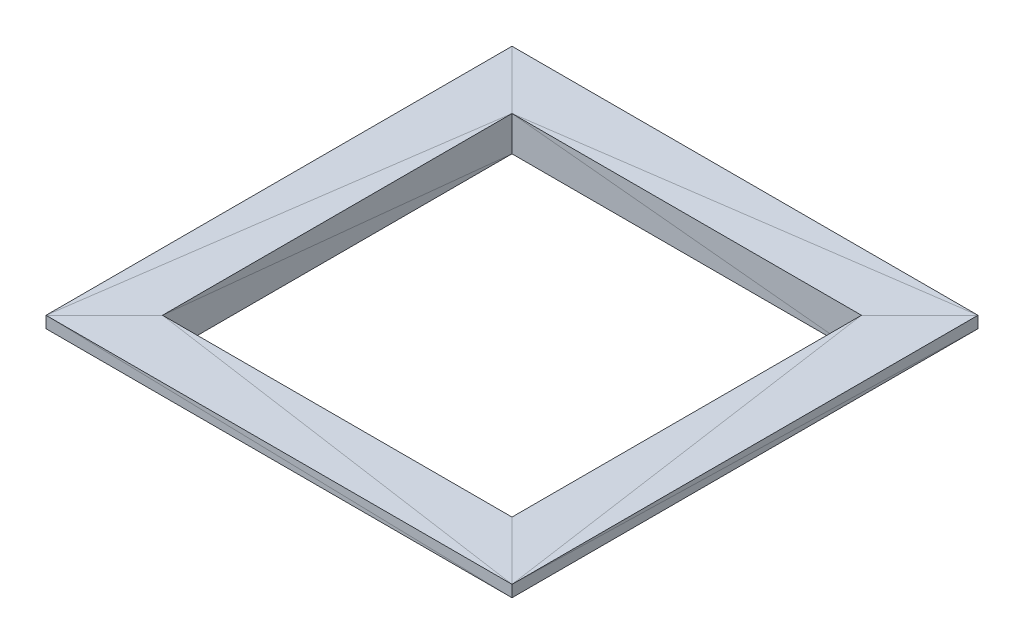
ISO-10303-21;
HEADER;
FILE_DESCRIPTION(('STEP AP214'),'2;1');
FILE_NAME('part.step','',(''),(''),'','','');
FILE_SCHEMA(('AUTOMOTIVE_DESIGN { 1 0 10303 214 1 1 1 1 }'));
ENDSEC;
DATA;
#1=APPLICATION_CONTEXT('core data for automotive mechanical design processes');
#2=APPLICATION_PROTOCOL_DEFINITION('international standard','automotive_design',2000,#1);
#3=PRODUCT_CONTEXT('',#1,'mechanical');
#4=PRODUCT('Part','Part','',(#3));
#5=PRODUCT_RELATED_PRODUCT_CATEGORY('part','',(#4));
#6=PRODUCT_DEFINITION_FORMATION('','',#4);
#7=PRODUCT_DEFINITION_CONTEXT('part definition',#1,'design');
#8=PRODUCT_DEFINITION('design','',#6,#7);
#9=PRODUCT_DEFINITION_SHAPE('','',#8);
#10=(LENGTH_UNIT() NAMED_UNIT(*) SI_UNIT(.MILLI.,.METRE.));
#11=(NAMED_UNIT(*) PLANE_ANGLE_UNIT() SI_UNIT($,.RADIAN.));
#12=(NAMED_UNIT(*) SI_UNIT($,.STERADIAN.) SOLID_ANGLE_UNIT());
#13=UNCERTAINTY_MEASURE_WITH_UNIT(LENGTH_MEASURE(1.E-05),#10,'distance_accuracy_value','');
#14=(GEOMETRIC_REPRESENTATION_CONTEXT(3) GLOBAL_UNCERTAINTY_ASSIGNED_CONTEXT((#13)) GLOBAL_UNIT_ASSIGNED_CONTEXT((#10,
#11,#12)) REPRESENTATION_CONTEXT('',''));
#15=CARTESIAN_POINT('',(0.,0.,0.));
#16=DIRECTION('',(0.,0.,1.));
#17=DIRECTION('',(1.,0.,0.));
#18=AXIS2_PLACEMENT_3D('',#15,#16,#17);
#19=CARTESIAN_POINT('',(0.,41.0000011324882,0.));
#20=DIRECTION('',(0.,-1.,0.));
#21=DIRECTION('',(0.,0.,-1.));
#22=AXIS2_PLACEMENT_3D('',#19,#20,#21);
#23=PLANE('',#22);
#24=DIRECTION('',(0.999480116165667,0.,-0.0322412374059238));
#25=VECTOR('',#24,1.);
#26=CARTESIAN_POINT('',(3.00000002607703,41.0000011324883,35.0000001490116));
#27=LINE('',#26,#25);
#28=CARTESIAN_POINT('',(3.00000002607703,41.0000011324883,35.0000001490116));
#29=VERTEX_POINT('',#28);
#30=CARTESIAN_POINT('',(34.000001847744,41.0000011324883,34.000001847744));
#31=VERTEX_POINT('',#30);
#32=EDGE_CURVE('E301',#29,#31,#27,.T.);
#33=ORIENTED_EDGE('',*,*,#32,.F.);
#34=DIRECTION('',(-0.707107439731254,0.,0.707106122641228));
#35=VECTOR('',#34,1.);
#36=CARTESIAN_POINT('',(4.00000018998981,41.0000011324883,34.000001847744));
#37=LINE('',#36,#35);
#38=CARTESIAN_POINT('',(4.00000018998981,41.0000011324883,34.000001847744));
#39=VERTEX_POINT('',#38);
#40=EDGE_CURVE('E18',#39,#29,#37,.T.);
#41=ORIENTED_EDGE('',*,*,#40,.F.);
#42=DIRECTION('',(-1.,0.,0.));
#43=VECTOR('',#42,1.);
#44=CARTESIAN_POINT('',(34.000001847744,41.0000011324883,34.000001847744));
#45=LINE('',#44,#43);
#46=EDGE_CURVE('E255',#31,#39,#45,.T.);
#47=ORIENTED_EDGE('',*,*,#46,.F.);
#48=EDGE_LOOP('',(#33,#41,#47));
#49=FACE_BOUND('',#48,.T.);
#50=ADVANCED_FACE('F15',(#49),#23,.T.);
#51=CARTESIAN_POINT('',(0.,0.,3.00000002607703));
#52=DIRECTION('',(0.,0.,-1.));
#53=DIRECTION('',(-1.,0.,0.));
#54=AXIS2_PLACEMENT_3D('',#51,#52,#53);
#55=PLANE('',#54);
#56=DIRECTION('',(0.,-1.,0.));
#57=VECTOR('',#56,1.);
#58=CARTESIAN_POINT('',(3.00000002607703,43.0000014603138,3.00000002607703));
#59=LINE('',#58,#57);
#60=CARTESIAN_POINT('',(3.00000002607703,43.0000014603138,3.00000002607703));
#61=VERTEX_POINT('',#60);
#62=CARTESIAN_POINT('',(3.00000002607703,41.0000011324883,3.00000002607703));
#63=VERTEX_POINT('',#62);
#64=EDGE_CURVE('E117',#61,#63,#59,.T.);
#65=ORIENTED_EDGE('',*,*,#64,.F.);
#66=DIRECTION('',(-1.,0.,0.));
#67=VECTOR('',#66,1.);
#68=CARTESIAN_POINT('',(35.0000001490116,43.0000014603138,3.00000002607703));
#69=LINE('',#68,#67);
#70=CARTESIAN_POINT('',(35.0000001490116,43.0000014603138,3.00000002607703));
#71=VERTEX_POINT('',#70);
#72=EDGE_CURVE('E111',#71,#61,#69,.T.);
#73=ORIENTED_EDGE('',*,*,#72,.F.);
#74=DIRECTION('',(0.998052577861257,0.0623782961012874,0.));
#75=VECTOR('',#74,1.);
#76=CARTESIAN_POINT('',(3.00000002607703,41.0000011324883,3.00000002607703));
#77=LINE('',#76,#75);
#78=EDGE_CURVE('E128',#63,#71,#77,.T.);
#79=ORIENTED_EDGE('',*,*,#78,.F.);
#80=EDGE_LOOP('',(#65,#73,#79));
#81=FACE_BOUND('',#80,.T.);
#82=ADVANCED_FACE('F125',(#81),#55,.T.);
#83=CARTESIAN_POINT('',(0.,41.0000011324882,0.));
#84=DIRECTION('',(0.,1.,0.));
#85=DIRECTION('',(0.,0.,1.));
#86=AXIS2_PLACEMENT_3D('',#83,#84,#85);
#87=PLANE('',#86);
#88=DIRECTION('',(0.,0.,1.));
#89=VECTOR('',#88,1.);
#90=CARTESIAN_POINT('',(3.00000002607703,41.0000011324883,3.00000002607703));
#91=LINE('',#90,#89);
#92=EDGE_CURVE('E119',#63,#29,#91,.T.);
#93=ORIENTED_EDGE('',*,*,#92,.F.);
#94=DIRECTION('',(-0.032241297397584,0.,-0.999480114230454));
#95=VECTOR('',#94,1.);
#96=CARTESIAN_POINT('',(4.00000018998981,41.0000011324883,34.000001847744));
#97=LINE('',#96,#95);
#98=EDGE_CURVE('E230',#39,#63,#97,.T.);
#99=ORIENTED_EDGE('',*,*,#98,.F.);
#100=ORIENTED_EDGE('',*,*,#40,.T.);
#101=EDGE_LOOP('',(#93,#99,#100));
#102=FACE_BOUND('',#101,.T.);
#103=ADVANCED_FACE('F767',(#102),#87,.F.);
#104=CARTESIAN_POINT('',(3.00000002607703,0.,0.));
#105=DIRECTION('',(1.,0.,0.));
#106=DIRECTION('',(0.,0.,-1.));
#107=AXIS2_PLACEMENT_3D('',#104,#105,#106);
#108=PLANE('',#107);
#109=ORIENTED_EDGE('',*,*,#92,.T.);
#110=DIRECTION('',(0.,-0.0623782961012874,0.998052577861257));
#111=VECTOR('',#110,1.);
#112=CARTESIAN_POINT('',(3.00000002607703,43.0000014603138,3.00000002607703));
#113=LINE('',#112,#111);
#114=EDGE_CURVE('E103',#61,#29,#113,.T.);
#115=ORIENTED_EDGE('',*,*,#114,.F.);
#116=ORIENTED_EDGE('',*,*,#64,.T.);
#117=EDGE_LOOP('',(#109,#115,#116));
#118=FACE_BOUND('',#117,.T.);
#119=ADVANCED_FACE('F116',(#118),#108,.F.);
#120=CARTESIAN_POINT('',(3.00000002607703,0.,0.));
#121=DIRECTION('',(-1.,0.,0.));
#122=DIRECTION('',(0.,0.,1.));
#123=AXIS2_PLACEMENT_3D('',#120,#121,#122);
#124=PLANE('',#123);
#125=DIRECTION('',(0.,-1.,0.));
#126=VECTOR('',#125,1.);
#127=CARTESIAN_POINT('',(3.00000002607703,43.0000014603138,35.0000001490116));
#128=LINE('',#127,#126);
#129=CARTESIAN_POINT('',(3.00000002607703,43.0000014603138,35.0000001490116));
#130=VERTEX_POINT('',#129);
#131=EDGE_CURVE('E106',#130,#29,#128,.T.);
#132=ORIENTED_EDGE('',*,*,#131,.F.);
#133=DIRECTION('',(0.,0.,1.));
#134=VECTOR('',#133,1.);
#135=CARTESIAN_POINT('',(3.00000002607703,43.0000014603138,3.00000002607703));
#136=LINE('',#135,#134);
#137=EDGE_CURVE('E100',#61,#130,#136,.T.);
#138=ORIENTED_EDGE('',*,*,#137,.F.);
#139=ORIENTED_EDGE('',*,*,#114,.T.);
#140=EDGE_LOOP('',(#132,#138,#139));
#141=FACE_BOUND('',#140,.T.);
#142=ADVANCED_FACE('F102',(#141),#124,.T.);
#143=CARTESIAN_POINT('',(0.,43.9999997615814,0.));
#144=DIRECTION('',(0.,1.,0.));
#145=DIRECTION('',(0.,0.,1.));
#146=AXIS2_PLACEMENT_3D('',#143,#144,#145);
#147=PLANE('',#146);
#148=DIRECTION('',(0.707106649477631,0.,-0.70710691289544));
#149=VECTOR('',#148,1.);
#150=CARTESIAN_POINT('',(34.000001847744,43.9999997615814,4.00000018998981));
#151=LINE('',#150,#149);
#152=CARTESIAN_POINT('',(34.000001847744,43.9999997615814,4.0000001899898));
#153=VERTEX_POINT('',#152);
#154=CARTESIAN_POINT('',(39.0000008046627,43.9999997615814,-1.00000062957406));
#155=VERTEX_POINT('',#154);
#156=EDGE_CURVE('E207',#153,#155,#151,.T.);
#157=ORIENTED_EDGE('',*,*,#156,.F.);
#158=DIRECTION('',(-0.141421324890591,0.,-0.989949498139269));
#159=VECTOR('',#158,1.);
#160=CARTESIAN_POINT('',(39.0000008046627,43.9999997615814,39.0000008046627));
#161=LINE('',#160,#159);
#162=CARTESIAN_POINT('',(39.0000008046627,43.9999997615814,39.0000008046627));
#163=VERTEX_POINT('',#162);
#164=EDGE_CURVE('E209',#163,#153,#161,.T.);
#165=ORIENTED_EDGE('',*,*,#164,.F.);
#166=DIRECTION('',(0.,0.,1.));
#167=VECTOR('',#166,1.);
#168=CARTESIAN_POINT('',(39.0000008046627,43.9999997615814,-1.00000062957406));
#169=LINE('',#168,#167);
#170=EDGE_CURVE('E182',#155,#163,#169,.T.);
#171=ORIENTED_EDGE('',*,*,#170,.F.);
#172=EDGE_LOOP('',(#157,#165,#171));
#173=FACE_BOUND('',#172,.T.);
#174=ADVANCED_FACE('F206',(#173),#147,.T.);
#175=CARTESIAN_POINT('',(39.0000008046627,0.,0.));
#176=DIRECTION('',(1.,0.,0.));
#177=DIRECTION('',(0.,0.,-1.));
#178=AXIS2_PLACEMENT_3D('',#175,#176,#177);
#179=PLANE('',#178);
#180=DIRECTION('',(0.,1.,0.));
#181=VECTOR('',#180,1.);
#182=CARTESIAN_POINT('',(39.0000008046627,43.0000014603138,39.0000008046627));
#183=LINE('',#182,#181);
#184=CARTESIAN_POINT('',(39.0000008046627,43.0000014603138,39.0000008046627));
#185=VERTEX_POINT('',#184);
#186=EDGE_CURVE('E328',#185,#163,#183,.T.);
#187=ORIENTED_EDGE('',*,*,#186,.F.);
#188=DIRECTION('',(0.,0.,1.));
#189=VECTOR('',#188,1.);
#190=CARTESIAN_POINT('',(39.0000008046627,43.0000014603138,-1.00000062957406));
#191=LINE('',#190,#189);
#192=CARTESIAN_POINT('',(39.0000008046627,43.0000014603138,-1.00000062957406));
#193=VERTEX_POINT('',#192);
#194=EDGE_CURVE('E179',#193,#185,#191,.T.);
#195=ORIENTED_EDGE('',*,*,#194,.F.);
#196=DIRECTION('',(0.,-0.0249921478361199,-0.999687647491224));
#197=VECTOR('',#196,1.);
#198=CARTESIAN_POINT('',(39.0000008046627,43.9999997615814,39.0000008046627));
#199=LINE('',#198,#197);
#200=EDGE_CURVE('E121',#163,#193,#199,.T.);
#201=ORIENTED_EDGE('',*,*,#200,.F.);
#202=EDGE_LOOP('',(#187,#195,#201));
#203=FACE_BOUND('',#202,.T.);
#204=ADVANCED_FACE('F737',(#203),#179,.T.);
#205=CARTESIAN_POINT('',(0.,43.0000014603138,0.));
#206=DIRECTION('',(0.,1.,0.));
#207=DIRECTION('',(0.,0.,1.));
#208=AXIS2_PLACEMENT_3D('',#205,#206,#207);
#209=PLANE('',#208);
#210=DIRECTION('',(0.,0.,1.));
#211=VECTOR('',#210,1.);
#212=CARTESIAN_POINT('',(35.0000001490116,43.0000014603138,3.00000002607703));
#213=LINE('',#212,#211);
#214=CARTESIAN_POINT('',(35.0000001490116,43.0000014603138,35.0000001490116));
#215=VERTEX_POINT('',#214);
#216=EDGE_CURVE('E263',#71,#215,#213,.T.);
#217=ORIENTED_EDGE('',*,*,#216,.F.);
#218=DIRECTION('',(-0.11043154159602,0.,-0.993883732949044));
#219=VECTOR('',#218,1.);
#220=CARTESIAN_POINT('',(39.0000008046627,43.0000014603138,39.0000008046627));
#221=LINE('',#220,#219);
#222=EDGE_CURVE('E177',#185,#71,#221,.T.);
#223=ORIENTED_EDGE('',*,*,#222,.F.);
#224=DIRECTION('',(0.707106781186548,0.,0.707106781186548));
#225=VECTOR('',#224,1.);
#226=CARTESIAN_POINT('',(35.0000001490116,43.0000014603138,35.0000001490116));
#227=LINE('',#226,#225);
#228=EDGE_CURVE('E297',#215,#185,#227,.T.);
#229=ORIENTED_EDGE('',*,*,#228,.F.);
#230=EDGE_LOOP('',(#217,#223,#229));
#231=FACE_BOUND('',#230,.T.);
#232=ADVANCED_FACE('F729',(#231),#209,.F.);
#233=CARTESIAN_POINT('',(0.,43.9999997615814,0.));
#234=DIRECTION('',(0.,1.,0.));
#235=DIRECTION('',(0.,0.,1.));
#236=AXIS2_PLACEMENT_3D('',#233,#234,#235);
#237=PLANE('',#236);
#238=DIRECTION('',(-0.707106781186548,0.,-0.707106781186548));
#239=VECTOR('',#238,1.);
#240=CARTESIAN_POINT('',(4.00000018998981,43.9999997615814,4.00000018998981));
#241=LINE('',#240,#239);
#242=CARTESIAN_POINT('',(4.00000018998981,43.9999997615814,4.00000018998981));
#243=VERTEX_POINT('',#242);
#244=CARTESIAN_POINT('',(-1.00000062957406,43.9999997615814,-1.00000062957406));
#245=VERTEX_POINT('',#244);
#246=EDGE_CURVE('E33',#243,#245,#241,.T.);
#247=ORIENTED_EDGE('',*,*,#246,.F.);
#248=DIRECTION('',(-0.989949490763571,0.,0.14142137652048));
#249=VECTOR('',#248,1.);
#250=CARTESIAN_POINT('',(39.0000008046627,43.9999997615814,-1.00000062957406));
#251=LINE('',#250,#249);
#252=EDGE_CURVE('E214',#155,#243,#251,.T.);
#253=ORIENTED_EDGE('',*,*,#252,.F.);
#254=DIRECTION('',(1.,0.,0.));
#255=VECTOR('',#254,1.);
#256=CARTESIAN_POINT('',(-1.00000062957406,43.9999997615814,-1.00000062957406));
#257=LINE('',#256,#255);
#258=EDGE_CURVE('E174',#245,#155,#257,.T.);
#259=ORIENTED_EDGE('',*,*,#258,.F.);
#260=EDGE_LOOP('',(#247,#253,#259));
#261=FACE_BOUND('',#260,.T.);
#262=ADVANCED_FACE('F721',(#261),#237,.T.);
#263=CARTESIAN_POINT('',(39.0000008046627,0.,0.));
#264=DIRECTION('',(-1.,0.,0.));
#265=DIRECTION('',(0.,0.,1.));
#266=AXIS2_PLACEMENT_3D('',#263,#264,#265);
#267=PLANE('',#266);
#268=ORIENTED_EDGE('',*,*,#170,.T.);
#269=ORIENTED_EDGE('',*,*,#200,.T.);
#270=DIRECTION('',(0.,-1.,0.));
#271=VECTOR('',#270,1.);
#272=CARTESIAN_POINT('',(39.0000008046627,43.9999997615814,-1.00000062957406));
#273=LINE('',#272,#271);
#274=EDGE_CURVE('E168',#155,#193,#273,.T.);
#275=ORIENTED_EDGE('',*,*,#274,.F.);
#276=EDGE_LOOP('',(#268,#269,#275));
#277=FACE_BOUND('',#276,.T.);
#278=ADVANCED_FACE('F190',(#277),#267,.F.);
#279=CARTESIAN_POINT('',(0.,43.0000014603138,0.));
#280=DIRECTION('',(0.,-1.,0.));
#281=DIRECTION('',(0.,0.,-1.));
#282=AXIS2_PLACEMENT_3D('',#279,#280,#281);
#283=PLANE('',#282);
#284=ORIENTED_EDGE('',*,*,#222,.T.);
#285=DIRECTION('',(-0.707106781186548,0.,0.707106781186548));
#286=VECTOR('',#285,1.);
#287=CARTESIAN_POINT('',(39.0000008046627,43.0000014603138,-1.00000062957406));
#288=LINE('',#287,#286);
#289=EDGE_CURVE('E137',#193,#71,#288,.T.);
#290=ORIENTED_EDGE('',*,*,#289,.F.);
#291=ORIENTED_EDGE('',*,*,#194,.T.);
#292=EDGE_LOOP('',(#284,#290,#291));
#293=FACE_BOUND('',#292,.T.);
#294=ADVANCED_FACE('F196',(#293),#283,.T.);
#295=CARTESIAN_POINT('',(0.,0.,-1.00000062957406));
#296=DIRECTION('',(0.,0.,1.));
#297=DIRECTION('',(1.,0.,0.));
#298=AXIS2_PLACEMENT_3D('',#295,#296,#297);
#299=PLANE('',#298);
#300=ORIENTED_EDGE('',*,*,#258,.T.);
#301=DIRECTION('',(0.999687647491224,0.0249921478361199,0.));
#302=VECTOR('',#301,1.);
#303=CARTESIAN_POINT('',(-1.00000062957406,43.0000014603138,-1.00000062957406));
#304=LINE('',#303,#302);
#305=CARTESIAN_POINT('',(-1.00000062957406,43.0000014603138,-1.00000062957406));
#306=VERTEX_POINT('',#305);
#307=EDGE_CURVE('E171',#306,#155,#304,.T.);
#308=ORIENTED_EDGE('',*,*,#307,.F.);
#309=DIRECTION('',(0.,-1.,0.));
#310=VECTOR('',#309,1.);
#311=CARTESIAN_POINT('',(-1.00000062957406,43.9999997615814,-1.00000062957406));
#312=LINE('',#311,#310);
#313=EDGE_CURVE('E110',#245,#306,#312,.T.);
#314=ORIENTED_EDGE('',*,*,#313,.F.);
#315=EDGE_LOOP('',(#300,#308,#314));
#316=FACE_BOUND('',#315,.T.);
#317=ADVANCED_FACE('F202',(#316),#299,.F.);
#318=CARTESIAN_POINT('',(0.,0.,-1.00000062957406));
#319=DIRECTION('',(0.,0.,-1.));
#320=DIRECTION('',(-1.,0.,0.));
#321=AXIS2_PLACEMENT_3D('',#318,#319,#320);
#322=PLANE('',#321);
#323=ORIENTED_EDGE('',*,*,#274,.T.);
#324=DIRECTION('',(1.,0.,0.));
#325=VECTOR('',#324,1.);
#326=CARTESIAN_POINT('',(-1.00000062957406,43.0000014603138,-1.00000062957406));
#327=LINE('',#326,#325);
#328=EDGE_CURVE('E155',#306,#193,#327,.T.);
#329=ORIENTED_EDGE('',*,*,#328,.F.);
#330=ORIENTED_EDGE('',*,*,#307,.T.);
#331=EDGE_LOOP('',(#323,#329,#330));
#332=FACE_BOUND('',#331,.T.);
#333=ADVANCED_FACE('F199',(#332),#322,.T.);
#334=CARTESIAN_POINT('',(0.,43.0000014603138,0.));
#335=DIRECTION('',(0.,1.,0.));
#336=DIRECTION('',(0.,0.,1.));
#337=AXIS2_PLACEMENT_3D('',#334,#335,#336);
#338=PLANE('',#337);
#339=ORIENTED_EDGE('',*,*,#72,.T.);
#340=DIRECTION('',(-0.993883732949044,0.,0.11043154159602));
#341=VECTOR('',#340,1.);
#342=CARTESIAN_POINT('',(39.0000008046627,43.0000014603138,-1.00000062957406));
#343=LINE('',#342,#341);
#344=EDGE_CURVE('E134',#193,#61,#343,.T.);
#345=ORIENTED_EDGE('',*,*,#344,.F.);
#346=ORIENTED_EDGE('',*,*,#289,.T.);
#347=EDGE_LOOP('',(#339,#345,#346));
#348=FACE_BOUND('',#347,.T.);
#349=ADVANCED_FACE('F132',(#348),#338,.F.);
#350=CARTESIAN_POINT('',(0.,43.0000014603138,0.));
#351=DIRECTION('',(0.,-1.,0.));
#352=DIRECTION('',(0.,0.,-1.));
#353=AXIS2_PLACEMENT_3D('',#350,#351,#352);
#354=PLANE('',#353);
#355=ORIENTED_EDGE('',*,*,#137,.T.);
#356=DIRECTION('',(0.707106781186548,0.,-0.707106781186548));
#357=VECTOR('',#356,1.);
#358=CARTESIAN_POINT('',(-1.00000062957406,43.0000014603138,39.0000008046627));
#359=LINE('',#358,#357);
#360=CARTESIAN_POINT('',(-1.00000062957406,43.0000014603138,39.0000008046627));
#361=VERTEX_POINT('',#360);
#362=EDGE_CURVE('E143',#361,#130,#359,.T.);
#363=ORIENTED_EDGE('',*,*,#362,.F.);
#364=DIRECTION('',(-0.11043154159602,0.,0.993883732949044));
#365=VECTOR('',#364,1.);
#366=CARTESIAN_POINT('',(3.00000002607703,43.0000014603138,3.00000002607703));
#367=LINE('',#366,#365);
#368=EDGE_CURVE('E141',#61,#361,#367,.T.);
#369=ORIENTED_EDGE('',*,*,#368,.F.);
#370=EDGE_LOOP('',(#355,#363,#369));
#371=FACE_BOUND('',#370,.T.);
#372=ADVANCED_FACE('F142',(#371),#354,.T.);
#373=CARTESIAN_POINT('',(-1.00000062957406,0.,0.));
#374=DIRECTION('',(-1.,0.,0.));
#375=DIRECTION('',(0.,0.,1.));
#376=AXIS2_PLACEMENT_3D('',#373,#374,#375);
#377=PLANE('',#376);
#378=ORIENTED_EDGE('',*,*,#313,.T.);
#379=DIRECTION('',(0.,0.,-1.));
#380=VECTOR('',#379,1.);
#381=CARTESIAN_POINT('',(-1.00000062957406,43.0000014603138,39.0000008046627));
#382=LINE('',#381,#380);
#383=EDGE_CURVE('E148',#361,#306,#382,.T.);
#384=ORIENTED_EDGE('',*,*,#383,.F.);
#385=DIRECTION('',(0.,-0.0249921478361199,0.999687647491224));
#386=VECTOR('',#385,1.);
#387=CARTESIAN_POINT('',(-1.00000062957406,43.9999997615814,-1.00000062957406));
#388=LINE('',#387,#386);
#389=EDGE_CURVE('E322',#245,#361,#388,.T.);
#390=ORIENTED_EDGE('',*,*,#389,.F.);
#391=EDGE_LOOP('',(#378,#384,#390));
#392=FACE_BOUND('',#391,.T.);
#393=ADVANCED_FACE('F670',(#392),#377,.T.);
#394=CARTESIAN_POINT('',(0.,43.0000014603138,0.));
#395=DIRECTION('',(0.,-1.,0.));
#396=DIRECTION('',(0.,0.,-1.));
#397=AXIS2_PLACEMENT_3D('',#394,#395,#396);
#398=PLANE('',#397);
#399=ORIENTED_EDGE('',*,*,#344,.T.);
#400=DIRECTION('',(0.707106781186548,0.,0.707106781186548));
#401=VECTOR('',#400,1.);
#402=CARTESIAN_POINT('',(-1.00000062957406,43.0000014603138,-1.00000062957406));
#403=LINE('',#402,#401);
#404=EDGE_CURVE('E153',#306,#61,#403,.T.);
#405=ORIENTED_EDGE('',*,*,#404,.F.);
#406=ORIENTED_EDGE('',*,*,#328,.T.);
#407=EDGE_LOOP('',(#399,#405,#406));
#408=FACE_BOUND('',#407,.T.);
#409=ADVANCED_FACE('F152',(#408),#398,.T.);
#410=CARTESIAN_POINT('',(0.,43.0000014603138,0.));
#411=DIRECTION('',(0.,1.,0.));
#412=DIRECTION('',(0.,0.,1.));
#413=AXIS2_PLACEMENT_3D('',#410,#411,#412);
#414=PLANE('',#413);
#415=ORIENTED_EDGE('',*,*,#368,.T.);
#416=ORIENTED_EDGE('',*,*,#383,.T.);
#417=ORIENTED_EDGE('',*,*,#404,.T.);
#418=EDGE_LOOP('',(#415,#416,#417));
#419=FACE_BOUND('',#418,.T.);
#420=ADVANCED_FACE('F157',(#419),#414,.F.);
#421=CARTESIAN_POINT('',(0.,43.9999997615814,0.));
#422=DIRECTION('',(0.,1.,0.));
#423=DIRECTION('',(0.,0.,1.));
#424=AXIS2_PLACEMENT_3D('',#421,#422,#423);
#425=PLANE('',#424);
#426=DIRECTION('',(0.14142137652048,0.,-0.989949490763571));
#427=VECTOR('',#426,1.);
#428=CARTESIAN_POINT('',(-1.00000062957406,43.9999997615814,39.0000008046627));
#429=LINE('',#428,#427);
#430=CARTESIAN_POINT('',(-1.00000062957406,43.9999997615814,39.0000008046627));
#431=VERTEX_POINT('',#430);
#432=EDGE_CURVE('E330',#431,#243,#429,.T.);
#433=ORIENTED_EDGE('',*,*,#432,.F.);
#434=DIRECTION('',(-0.70710691289544,0.,0.707106649477631));
#435=VECTOR('',#434,1.);
#436=CARTESIAN_POINT('',(4.00000018998981,43.9999997615814,34.000001847744));
#437=LINE('',#436,#435);
#438=CARTESIAN_POINT('',(4.0000001899898,43.9999997615814,34.000001847744));
#439=VERTEX_POINT('',#438);
#440=EDGE_CURVE('E158',#439,#431,#437,.T.);
#441=ORIENTED_EDGE('',*,*,#440,.F.);
#442=DIRECTION('',(0.,0.,1.));
#443=VECTOR('',#442,1.);
#444=CARTESIAN_POINT('',(4.00000018998981,43.9999997615814,4.00000018998981));
#445=LINE('',#444,#443);
#446=EDGE_CURVE('E222',#243,#439,#445,.T.);
#447=ORIENTED_EDGE('',*,*,#446,.F.);
#448=EDGE_LOOP('',(#433,#441,#447));
#449=FACE_BOUND('',#448,.T.);
#450=ADVANCED_FACE('F352',(#449),#425,.T.);
#451=CARTESIAN_POINT('',(0.,43.9999997615814,0.));
#452=DIRECTION('',(0.,-1.,0.));
#453=DIRECTION('',(0.,0.,-1.));
#454=AXIS2_PLACEMENT_3D('',#451,#452,#453);
#455=PLANE('',#454);
#456=DIRECTION('',(-1.,0.,0.));
#457=VECTOR('',#456,1.);
#458=CARTESIAN_POINT('',(39.0000008046627,43.9999997615814,39.0000008046627));
#459=LINE('',#458,#457);
#460=EDGE_CURVE('E325',#163,#431,#459,.T.);
#461=ORIENTED_EDGE('',*,*,#460,.F.);
#462=DIRECTION('',(0.989949498139269,0.,0.141421324890591));
#463=VECTOR('',#462,1.);
#464=CARTESIAN_POINT('',(4.00000018998981,43.9999997615814,34.000001847744));
#465=LINE('',#464,#463);
#466=EDGE_CURVE('E260',#439,#163,#465,.T.);
#467=ORIENTED_EDGE('',*,*,#466,.F.);
#468=ORIENTED_EDGE('',*,*,#440,.T.);
#469=EDGE_LOOP('',(#461,#467,#468));
#470=FACE_BOUND('',#469,.T.);
#471=ADVANCED_FACE('F348',(#470),#455,.F.);
#472=CARTESIAN_POINT('',(0.,43.9999997615814,0.));
#473=DIRECTION('',(0.,1.,0.));
#474=DIRECTION('',(0.,0.,1.));
#475=AXIS2_PLACEMENT_3D('',#472,#473,#474);
#476=PLANE('',#475);
#477=ORIENTED_EDGE('',*,*,#432,.T.);
#478=ORIENTED_EDGE('',*,*,#246,.T.);
#479=DIRECTION('',(0.,0.,-1.));
#480=VECTOR('',#479,1.);
#481=CARTESIAN_POINT('',(-1.00000062957406,43.9999997615814,39.0000008046627));
#482=LINE('',#481,#480);
#483=EDGE_CURVE('E319',#431,#245,#482,.T.);
#484=ORIENTED_EDGE('',*,*,#483,.F.);
#485=EDGE_LOOP('',(#477,#478,#484));
#486=FACE_BOUND('',#485,.T.);
#487=ADVANCED_FACE('F335',(#486),#476,.T.);
#488=CARTESIAN_POINT('',(0.,0.,39.0000008046627));
#489=DIRECTION('',(0.,0.,-1.));
#490=DIRECTION('',(-1.,0.,0.));
#491=AXIS2_PLACEMENT_3D('',#488,#489,#490);
#492=PLANE('',#491);
#493=ORIENTED_EDGE('',*,*,#460,.T.);
#494=DIRECTION('',(-0.999687647491224,0.0249921478361199,0.));
#495=VECTOR('',#494,1.);
#496=CARTESIAN_POINT('',(39.0000008046627,43.0000014603138,39.0000008046627));
#497=LINE('',#496,#495);
#498=EDGE_CURVE('E316',#185,#431,#497,.T.);
#499=ORIENTED_EDGE('',*,*,#498,.F.);
#500=ORIENTED_EDGE('',*,*,#186,.T.);
#501=EDGE_LOOP('',(#493,#499,#500));
#502=FACE_BOUND('',#501,.T.);
#503=ADVANCED_FACE('F345',(#502),#492,.F.);
#504=CARTESIAN_POINT('',(-1.00000062957406,0.,0.));
#505=DIRECTION('',(1.,0.,0.));
#506=DIRECTION('',(0.,0.,-1.));
#507=AXIS2_PLACEMENT_3D('',#504,#505,#506);
#508=PLANE('',#507);
#509=ORIENTED_EDGE('',*,*,#483,.T.);
#510=ORIENTED_EDGE('',*,*,#389,.T.);
#511=DIRECTION('',(0.,-1.,0.));
#512=VECTOR('',#511,1.);
#513=CARTESIAN_POINT('',(-1.00000062957406,43.9999997615814,39.0000008046627));
#514=LINE('',#513,#512);
#515=EDGE_CURVE('E313',#431,#361,#514,.T.);
#516=ORIENTED_EDGE('',*,*,#515,.F.);
#517=EDGE_LOOP('',(#509,#510,#516));
#518=FACE_BOUND('',#517,.T.);
#519=ADVANCED_FACE('F338',(#518),#508,.F.);
#520=CARTESIAN_POINT('',(0.,0.,39.0000008046627));
#521=DIRECTION('',(0.,0.,1.));
#522=DIRECTION('',(1.,0.,0.));
#523=AXIS2_PLACEMENT_3D('',#520,#521,#522);
#524=PLANE('',#523);
#525=ORIENTED_EDGE('',*,*,#515,.T.);
#526=DIRECTION('',(-1.,0.,0.));
#527=VECTOR('',#526,1.);
#528=CARTESIAN_POINT('',(39.0000008046627,43.0000014603138,39.0000008046627));
#529=LINE('',#528,#527);
#530=EDGE_CURVE('E310',#185,#361,#529,.T.);
#531=ORIENTED_EDGE('',*,*,#530,.F.);
#532=ORIENTED_EDGE('',*,*,#498,.T.);
#533=EDGE_LOOP('',(#525,#531,#532));
#534=FACE_BOUND('',#533,.T.);
#535=ADVANCED_FACE('F342',(#534),#524,.T.);
#536=CARTESIAN_POINT('',(0.,41.0000011324883,0.));
#537=DIRECTION('',(0.,-1.,0.));
#538=DIRECTION('',(0.,0.,-1.));
#539=AXIS2_PLACEMENT_3D('',#536,#537,#538);
#540=PLANE('',#539);
#541=DIRECTION('',(-0.0322412393411354,0.,-0.999480116103241));
#542=VECTOR('',#541,1.);
#543=CARTESIAN_POINT('',(35.0000001490116,41.0000011324883,35.0000001490116));
#544=LINE('',#543,#542);
#545=CARTESIAN_POINT('',(35.0000001490116,41.0000011324883,35.0000001490116));
#546=VERTEX_POINT('',#545);
#547=CARTESIAN_POINT('',(34.000001847744,41.0000011324883,4.00000018998981));
#548=VERTEX_POINT('',#547);
#549=EDGE_CURVE('E281',#546,#548,#544,.T.);
#550=ORIENTED_EDGE('',*,*,#549,.F.);
#551=DIRECTION('',(0.707106781186548,0.,0.707106781186548));
#552=VECTOR('',#551,1.);
#553=CARTESIAN_POINT('',(34.000001847744,41.0000011324883,34.000001847744));
#554=LINE('',#553,#552);
#555=EDGE_CURVE('E304',#31,#546,#554,.T.);
#556=ORIENTED_EDGE('',*,*,#555,.F.);
#557=DIRECTION('',(0.,0.,1.));
#558=VECTOR('',#557,1.);
#559=CARTESIAN_POINT('',(34.000001847744,41.0000011324883,4.00000018998981));
#560=LINE('',#559,#558);
#561=EDGE_CURVE('E224',#548,#31,#560,.T.);
#562=ORIENTED_EDGE('',*,*,#561,.F.);
#563=EDGE_LOOP('',(#550,#556,#562));
#564=FACE_BOUND('',#563,.T.);
#565=ADVANCED_FACE('F604',(#564),#540,.T.);
#566=CARTESIAN_POINT('',(0.,43.0000014603138,0.));
#567=DIRECTION('',(0.,-1.,0.));
#568=DIRECTION('',(0.,0.,-1.));
#569=AXIS2_PLACEMENT_3D('',#566,#567,#568);
#570=PLANE('',#569);
#571=ORIENTED_EDGE('',*,*,#362,.T.);
#572=DIRECTION('',(-0.993883732949044,0.,-0.11043154159602));
#573=VECTOR('',#572,1.);
#574=CARTESIAN_POINT('',(39.0000008046627,43.0000014603138,39.0000008046627));
#575=LINE('',#574,#573);
#576=EDGE_CURVE('E298',#185,#130,#575,.T.);
#577=ORIENTED_EDGE('',*,*,#576,.F.);
#578=ORIENTED_EDGE('',*,*,#530,.T.);
#579=EDGE_LOOP('',(#571,#577,#578));
#580=FACE_BOUND('',#579,.T.);
#581=ADVANCED_FACE('F595',(#580),#570,.T.);
#582=CARTESIAN_POINT('',(0.,41.0000011324883,0.));
#583=DIRECTION('',(0.,1.,0.));
#584=DIRECTION('',(0.,0.,1.));
#585=AXIS2_PLACEMENT_3D('',#582,#583,#584);
#586=PLANE('',#585);
#587=DIRECTION('',(1.,0.,0.));
#588=VECTOR('',#587,1.);
#589=CARTESIAN_POINT('',(3.00000002607703,41.0000011324883,35.0000001490116));
#590=LINE('',#589,#588);
#591=EDGE_CURVE('E291',#29,#546,#590,.T.);
#592=ORIENTED_EDGE('',*,*,#591,.F.);
#593=ORIENTED_EDGE('',*,*,#32,.T.);
#594=ORIENTED_EDGE('',*,*,#555,.T.);
#595=EDGE_LOOP('',(#592,#593,#594));
#596=FACE_BOUND('',#595,.T.);
#597=ADVANCED_FACE('F586',(#596),#586,.F.);
#598=CARTESIAN_POINT('',(0.,43.0000014603138,0.));
#599=DIRECTION('',(0.,-1.,0.));
#600=DIRECTION('',(0.,0.,-1.));
#601=AXIS2_PLACEMENT_3D('',#598,#599,#600);
#602=PLANE('',#601);
#603=DIRECTION('',(-1.,0.,0.));
#604=VECTOR('',#603,1.);
#605=CARTESIAN_POINT('',(35.0000001490116,43.0000014603138,35.0000001490116));
#606=LINE('',#605,#604);
#607=EDGE_CURVE('E288',#215,#130,#606,.T.);
#608=ORIENTED_EDGE('',*,*,#607,.F.);
#609=ORIENTED_EDGE('',*,*,#228,.T.);
#610=ORIENTED_EDGE('',*,*,#576,.T.);
#611=EDGE_LOOP('',(#608,#609,#610));
#612=FACE_BOUND('',#611,.T.);
#613=ADVANCED_FACE('F577',(#612),#602,.T.);
#614=CARTESIAN_POINT('',(0.,0.,35.0000001490116));
#615=DIRECTION('',(0.,0.,-1.));
#616=DIRECTION('',(-1.,0.,0.));
#617=AXIS2_PLACEMENT_3D('',#614,#615,#616);
#618=PLANE('',#617);
#619=ORIENTED_EDGE('',*,*,#591,.T.);
#620=DIRECTION('',(0.998052577861257,-0.0623782961012874,0.));
#621=VECTOR('',#620,1.);
#622=CARTESIAN_POINT('',(3.00000002607703,43.0000014603138,35.0000001490116));
#623=LINE('',#622,#621);
#624=EDGE_CURVE('E285',#130,#546,#623,.T.);
#625=ORIENTED_EDGE('',*,*,#624,.F.);
#626=ORIENTED_EDGE('',*,*,#131,.T.);
#627=EDGE_LOOP('',(#619,#625,#626));
#628=FACE_BOUND('',#627,.T.);
#629=ADVANCED_FACE('F568',(#628),#618,.F.);
#630=CARTESIAN_POINT('',(0.,0.,35.0000001490116));
#631=DIRECTION('',(0.,0.,1.));
#632=DIRECTION('',(1.,0.,0.));
#633=AXIS2_PLACEMENT_3D('',#630,#631,#632);
#634=PLANE('',#633);
#635=DIRECTION('',(0.,-1.,0.));
#636=VECTOR('',#635,1.);
#637=CARTESIAN_POINT('',(35.0000001490116,43.0000014603138,35.0000001490116));
#638=LINE('',#637,#636);
#639=EDGE_CURVE('E274',#215,#546,#638,.T.);
#640=ORIENTED_EDGE('',*,*,#639,.F.);
#641=ORIENTED_EDGE('',*,*,#607,.T.);
#642=ORIENTED_EDGE('',*,*,#624,.T.);
#643=EDGE_LOOP('',(#640,#641,#642));
#644=FACE_BOUND('',#643,.T.);
#645=ADVANCED_FACE('F560',(#644),#634,.T.);
#646=CARTESIAN_POINT('',(0.,41.0000011324882,0.));
#647=DIRECTION('',(0.,-1.,0.));
#648=DIRECTION('',(0.,0.,-1.));
#649=AXIS2_PLACEMENT_3D('',#646,#647,#648);
#650=PLANE('',#649);
#651=DIRECTION('',(-1.,0.,0.));
#652=VECTOR('',#651,1.);
#653=CARTESIAN_POINT('',(35.0000001490116,41.0000011324883,3.00000002607703));
#654=LINE('',#653,#652);
#655=CARTESIAN_POINT('',(35.0000001490116,41.0000011324883,3.00000002607703));
#656=VERTEX_POINT('',#655);
#657=EDGE_CURVE('E277',#656,#63,#654,.T.);
#658=ORIENTED_EDGE('',*,*,#657,.F.);
#659=DIRECTION('',(0.707106122641228,0.,-0.707107439731254));
#660=VECTOR('',#659,1.);
#661=CARTESIAN_POINT('',(34.000001847744,41.0000011324883,4.00000018998981));
#662=LINE('',#661,#660);
#663=EDGE_CURVE('E282',#548,#656,#662,.T.);
#664=ORIENTED_EDGE('',*,*,#663,.F.);
#665=DIRECTION('',(0.999480114230454,0.,0.032241297397584));
#666=VECTOR('',#665,1.);
#667=CARTESIAN_POINT('',(3.00000002607703,41.0000011324883,3.00000002607703));
#668=LINE('',#667,#666);
#669=EDGE_CURVE('E373',#63,#548,#668,.T.);
#670=ORIENTED_EDGE('',*,*,#669,.F.);
#671=EDGE_LOOP('',(#658,#664,#670));
#672=FACE_BOUND('',#671,.T.);
#673=ADVANCED_FACE('F551',(#672),#650,.T.);
#674=CARTESIAN_POINT('',(0.,41.0000011324882,0.));
#675=DIRECTION('',(0.,1.,0.));
#676=DIRECTION('',(0.,0.,1.));
#677=AXIS2_PLACEMENT_3D('',#674,#675,#676);
#678=PLANE('',#677);
#679=DIRECTION('',(0.,0.,-1.));
#680=VECTOR('',#679,1.);
#681=CARTESIAN_POINT('',(35.0000001490116,41.0000011324883,35.0000001490116));
#682=LINE('',#681,#680);
#683=EDGE_CURVE('E271',#546,#656,#682,.T.);
#684=ORIENTED_EDGE('',*,*,#683,.F.);
#685=ORIENTED_EDGE('',*,*,#549,.T.);
#686=ORIENTED_EDGE('',*,*,#663,.T.);
#687=EDGE_LOOP('',(#684,#685,#686));
#688=FACE_BOUND('',#687,.T.);
#689=ADVANCED_FACE('F542',(#688),#678,.F.);
#690=CARTESIAN_POINT('',(0.,0.,3.00000002607703));
#691=DIRECTION('',(0.,0.,1.));
#692=DIRECTION('',(1.,0.,0.));
#693=AXIS2_PLACEMENT_3D('',#690,#691,#692);
#694=PLANE('',#693);
#695=ORIENTED_EDGE('',*,*,#657,.T.);
#696=ORIENTED_EDGE('',*,*,#78,.T.);
#697=DIRECTION('',(0.,1.,0.));
#698=VECTOR('',#697,1.);
#699=CARTESIAN_POINT('',(35.0000001490116,41.0000011324883,3.00000002607703));
#700=LINE('',#699,#698);
#701=EDGE_CURVE('E266',#656,#71,#700,.T.);
#702=ORIENTED_EDGE('',*,*,#701,.F.);
#703=EDGE_LOOP('',(#695,#696,#702));
#704=FACE_BOUND('',#703,.T.);
#705=ADVANCED_FACE('F533',(#704),#694,.F.);
#706=CARTESIAN_POINT('',(35.0000001490116,0.,0.));
#707=DIRECTION('',(-1.,0.,0.));
#708=DIRECTION('',(0.,0.,1.));
#709=AXIS2_PLACEMENT_3D('',#706,#707,#708);
#710=PLANE('',#709);
#711=ORIENTED_EDGE('',*,*,#683,.T.);
#712=DIRECTION('',(0.,-0.0623782961012874,-0.998052577861257));
#713=VECTOR('',#712,1.);
#714=CARTESIAN_POINT('',(35.0000001490116,43.0000014603138,35.0000001490116));
#715=LINE('',#714,#713);
#716=EDGE_CURVE('E262',#215,#656,#715,.T.);
#717=ORIENTED_EDGE('',*,*,#716,.F.);
#718=ORIENTED_EDGE('',*,*,#639,.T.);
#719=EDGE_LOOP('',(#711,#717,#718));
#720=FACE_BOUND('',#719,.T.);
#721=ADVANCED_FACE('F524',(#720),#710,.F.);
#722=CARTESIAN_POINT('',(35.0000001490116,0.,0.));
#723=DIRECTION('',(1.,0.,0.));
#724=DIRECTION('',(0.,0.,-1.));
#725=AXIS2_PLACEMENT_3D('',#722,#723,#724);
#726=PLANE('',#725);
#727=ORIENTED_EDGE('',*,*,#701,.T.);
#728=ORIENTED_EDGE('',*,*,#216,.T.);
#729=ORIENTED_EDGE('',*,*,#716,.T.);
#730=EDGE_LOOP('',(#727,#728,#729));
#731=FACE_BOUND('',#730,.T.);
#732=ADVANCED_FACE('F516',(#731),#726,.T.);
#733=CARTESIAN_POINT('',(0.,43.9999997615814,0.));
#734=DIRECTION('',(0.,1.,0.));
#735=DIRECTION('',(0.,0.,1.));
#736=AXIS2_PLACEMENT_3D('',#733,#734,#735);
#737=PLANE('',#736);
#738=DIRECTION('',(0.707106781186548,0.,0.707106781186548));
#739=VECTOR('',#738,1.);
#740=CARTESIAN_POINT('',(34.000001847744,43.9999997615814,34.000001847744));
#741=LINE('',#740,#739);
#742=CARTESIAN_POINT('',(34.000001847744,43.9999997615814,34.000001847744));
#743=VERTEX_POINT('',#742);
#744=EDGE_CURVE('E253',#743,#163,#741,.T.);
#745=ORIENTED_EDGE('',*,*,#744,.F.);
#746=DIRECTION('',(1.,0.,0.));
#747=VECTOR('',#746,1.);
#748=CARTESIAN_POINT('',(4.00000018998981,43.9999997615814,34.000001847744));
#749=LINE('',#748,#747);
#750=EDGE_CURVE('E247',#439,#743,#749,.T.);
#751=ORIENTED_EDGE('',*,*,#750,.F.);
#752=ORIENTED_EDGE('',*,*,#466,.T.);
#753=EDGE_LOOP('',(#745,#751,#752));
#754=FACE_BOUND('',#753,.T.);
#755=ADVANCED_FACE('F356',(#754),#737,.T.);
#756=CARTESIAN_POINT('',(0.,0.,34.000001847744));
#757=DIRECTION('',(0.,0.,-1.));
#758=DIRECTION('',(-1.,0.,0.));
#759=AXIS2_PLACEMENT_3D('',#756,#757,#758);
#760=PLANE('',#759);
#761=DIRECTION('',(0.,1.,0.));
#762=VECTOR('',#761,1.);
#763=CARTESIAN_POINT('',(34.000001847744,41.0000011324883,34.000001847744));
#764=LINE('',#763,#762);
#765=EDGE_CURVE('E244',#31,#743,#764,.T.);
#766=ORIENTED_EDGE('',*,*,#765,.F.);
#767=ORIENTED_EDGE('',*,*,#46,.T.);
#768=DIRECTION('',(-0.995037195256377,-0.0995036685571074,0.));
#769=VECTOR('',#768,1.);
#770=CARTESIAN_POINT('',(34.000001847744,43.9999997615814,34.000001847744));
#771=LINE('',#770,#769);
#772=EDGE_CURVE('E250',#743,#39,#771,.T.);
#773=ORIENTED_EDGE('',*,*,#772,.F.);
#774=EDGE_LOOP('',(#766,#767,#773));
#775=FACE_BOUND('',#774,.T.);
#776=ADVANCED_FACE('F404',(#775),#760,.T.);
#777=CARTESIAN_POINT('',(0.,43.9999997615814,0.));
#778=DIRECTION('',(0.,1.,0.));
#779=DIRECTION('',(0.,0.,1.));
#780=AXIS2_PLACEMENT_3D('',#777,#778,#779);
#781=PLANE('',#780);
#782=DIRECTION('',(0.,0.,-1.));
#783=VECTOR('',#782,1.);
#784=CARTESIAN_POINT('',(34.000001847744,43.9999997615814,34.000001847744));
#785=LINE('',#784,#783);
#786=EDGE_CURVE('E241',#743,#153,#785,.T.);
#787=ORIENTED_EDGE('',*,*,#786,.F.);
#788=ORIENTED_EDGE('',*,*,#744,.T.);
#789=ORIENTED_EDGE('',*,*,#164,.T.);
#790=EDGE_LOOP('',(#787,#788,#789));
#791=FACE_BOUND('',#790,.T.);
#792=ADVANCED_FACE('F402',(#791),#781,.T.);
#793=CARTESIAN_POINT('',(0.,0.,34.000001847744));
#794=DIRECTION('',(0.,0.,1.));
#795=DIRECTION('',(1.,0.,0.));
#796=AXIS2_PLACEMENT_3D('',#793,#794,#795);
#797=PLANE('',#796);
#798=ORIENTED_EDGE('',*,*,#750,.T.);
#799=ORIENTED_EDGE('',*,*,#772,.T.);
#800=DIRECTION('',(0.,-1.,0.));
#801=VECTOR('',#800,1.);
#802=CARTESIAN_POINT('',(4.00000018998981,43.9999997615814,34.000001847744));
#803=LINE('',#802,#801);
#804=EDGE_CURVE('E238',#439,#39,#803,.T.);
#805=ORIENTED_EDGE('',*,*,#804,.F.);
#806=EDGE_LOOP('',(#798,#799,#805));
#807=FACE_BOUND('',#806,.T.);
#808=ADVANCED_FACE('F360',(#807),#797,.F.);
#809=CARTESIAN_POINT('',(34.000001847744,0.,0.));
#810=DIRECTION('',(1.,0.,0.));
#811=DIRECTION('',(0.,0.,-1.));
#812=AXIS2_PLACEMENT_3D('',#809,#810,#811);
#813=PLANE('',#812);
#814=ORIENTED_EDGE('',*,*,#786,.T.);
#815=DIRECTION('',(0.,0.0995036685571074,-0.995037195256377));
#816=VECTOR('',#815,1.);
#817=CARTESIAN_POINT('',(34.000001847744,41.0000011324883,34.000001847744));
#818=LINE('',#817,#816);
#819=EDGE_CURVE('E227',#31,#153,#818,.T.);
#820=ORIENTED_EDGE('',*,*,#819,.F.);
#821=ORIENTED_EDGE('',*,*,#765,.T.);
#822=EDGE_LOOP('',(#814,#820,#821));
#823=FACE_BOUND('',#822,.T.);
#824=ADVANCED_FACE('F398',(#823),#813,.F.);
#825=CARTESIAN_POINT('',(4.00000018998981,0.,0.));
#826=DIRECTION('',(1.,0.,0.));
#827=DIRECTION('',(0.,0.,-1.));
#828=AXIS2_PLACEMENT_3D('',#825,#826,#827);
#829=PLANE('',#828);
#830=ORIENTED_EDGE('',*,*,#804,.T.);
#831=DIRECTION('',(0.,0.,1.));
#832=VECTOR('',#831,1.);
#833=CARTESIAN_POINT('',(4.00000018998981,41.0000011324883,4.00000018998981));
#834=LINE('',#833,#832);
#835=CARTESIAN_POINT('',(4.00000018998981,41.0000011324883,4.00000018998981));
#836=VERTEX_POINT('',#835);
#837=EDGE_CURVE('E235',#836,#39,#834,.T.);
#838=ORIENTED_EDGE('',*,*,#837,.F.);
#839=DIRECTION('',(0.,-0.0995036685571074,-0.995037195256377));
#840=VECTOR('',#839,1.);
#841=CARTESIAN_POINT('',(4.00000018998981,43.9999997615814,34.000001847744));
#842=LINE('',#841,#840);
#843=EDGE_CURVE('E219',#439,#836,#842,.T.);
#844=ORIENTED_EDGE('',*,*,#843,.F.);
#845=EDGE_LOOP('',(#830,#838,#844));
#846=FACE_BOUND('',#845,.T.);
#847=ADVANCED_FACE('F363',(#846),#829,.T.);
#848=CARTESIAN_POINT('',(0.,41.0000011324883,0.));
#849=DIRECTION('',(0.,-1.,0.));
#850=DIRECTION('',(0.,0.,-1.));
#851=AXIS2_PLACEMENT_3D('',#848,#849,#850);
#852=PLANE('',#851);
#853=ORIENTED_EDGE('',*,*,#98,.T.);
#854=DIRECTION('',(-0.707106781186548,0.,-0.707106781186548));
#855=VECTOR('',#854,1.);
#856=CARTESIAN_POINT('',(4.00000018998981,41.0000011324883,4.00000018998981));
#857=LINE('',#856,#855);
#858=EDGE_CURVE('E370',#836,#63,#857,.T.);
#859=ORIENTED_EDGE('',*,*,#858,.F.);
#860=ORIENTED_EDGE('',*,*,#837,.T.);
#861=EDGE_LOOP('',(#853,#859,#860));
#862=FACE_BOUND('',#861,.T.);
#863=ADVANCED_FACE('F429',(#862),#852,.T.);
#864=CARTESIAN_POINT('',(34.000001847744,0.,0.));
#865=DIRECTION('',(-1.,0.,0.));
#866=DIRECTION('',(0.,0.,1.));
#867=AXIS2_PLACEMENT_3D('',#864,#865,#866);
#868=PLANE('',#867);
#869=DIRECTION('',(0.,1.,0.));
#870=VECTOR('',#869,1.);
#871=CARTESIAN_POINT('',(34.000001847744,41.0000011324883,4.00000018998981));
#872=LINE('',#871,#870);
#873=EDGE_CURVE('E378',#548,#153,#872,.T.);
#874=ORIENTED_EDGE('',*,*,#873,.F.);
#875=ORIENTED_EDGE('',*,*,#561,.T.);
#876=ORIENTED_EDGE('',*,*,#819,.T.);
#877=EDGE_LOOP('',(#874,#875,#876));
#878=FACE_BOUND('',#877,.T.);
#879=ADVANCED_FACE('F395',(#878),#868,.T.);
#880=CARTESIAN_POINT('',(0.,43.9999997615814,0.));
#881=DIRECTION('',(0.,1.,0.));
#882=DIRECTION('',(0.,0.,1.));
#883=AXIS2_PLACEMENT_3D('',#880,#881,#882);
#884=PLANE('',#883);
#885=DIRECTION('',(-1.,0.,0.));
#886=VECTOR('',#885,1.);
#887=CARTESIAN_POINT('',(34.000001847744,43.9999997615814,4.00000018998981));
#888=LINE('',#887,#886);
#889=EDGE_CURVE('E217',#153,#243,#888,.T.);
#890=ORIENTED_EDGE('',*,*,#889,.F.);
#891=ORIENTED_EDGE('',*,*,#156,.T.);
#892=ORIENTED_EDGE('',*,*,#252,.T.);
#893=EDGE_LOOP('',(#890,#891,#892));
#894=FACE_BOUND('',#893,.T.);
#895=ADVANCED_FACE('F213',(#894),#884,.T.);
#896=CARTESIAN_POINT('',(4.00000018998981,0.,0.));
#897=DIRECTION('',(-1.,0.,0.));
#898=DIRECTION('',(0.,0.,1.));
#899=AXIS2_PLACEMENT_3D('',#896,#897,#898);
#900=PLANE('',#899);
#901=ORIENTED_EDGE('',*,*,#446,.T.);
#902=ORIENTED_EDGE('',*,*,#843,.T.);
#903=DIRECTION('',(0.,-1.,0.));
#904=VECTOR('',#903,1.);
#905=CARTESIAN_POINT('',(4.00000018998981,43.9999997615814,4.00000018998981));
#906=LINE('',#905,#904);
#907=EDGE_CURVE('E369',#243,#836,#906,.T.);
#908=ORIENTED_EDGE('',*,*,#907,.F.);
#909=EDGE_LOOP('',(#901,#902,#908));
#910=FACE_BOUND('',#909,.T.);
#911=ADVANCED_FACE('F367',(#910),#900,.F.);
#912=CARTESIAN_POINT('',(0.,41.0000011324883,0.));
#913=DIRECTION('',(0.,1.,0.));
#914=DIRECTION('',(0.,0.,1.));
#915=AXIS2_PLACEMENT_3D('',#912,#913,#914);
#916=PLANE('',#915);
#917=ORIENTED_EDGE('',*,*,#669,.T.);
#918=DIRECTION('',(1.,0.,0.));
#919=VECTOR('',#918,1.);
#920=CARTESIAN_POINT('',(4.00000018998981,41.0000011324883,4.00000018998981));
#921=LINE('',#920,#919);
#922=EDGE_CURVE('E24',#836,#548,#921,.T.);
#923=ORIENTED_EDGE('',*,*,#922,.F.);
#924=ORIENTED_EDGE('',*,*,#858,.T.);
#925=EDGE_LOOP('',(#917,#923,#924));
#926=FACE_BOUND('',#925,.T.);
#927=ADVANCED_FACE('F387',(#926),#916,.F.);
#928=CARTESIAN_POINT('',(0.,0.,4.00000018998981));
#929=DIRECTION('',(0.,0.,-1.));
#930=DIRECTION('',(-1.,0.,0.));
#931=AXIS2_PLACEMENT_3D('',#928,#929,#930);
#932=PLANE('',#931);
#933=ORIENTED_EDGE('',*,*,#889,.T.);
#934=DIRECTION('',(-0.995037195256377,0.0995036685571074,0.));
#935=VECTOR('',#934,1.);
#936=CARTESIAN_POINT('',(34.000001847744,41.0000011324883,4.00000018998981));
#937=LINE('',#936,#935);
#938=EDGE_CURVE('E9',#548,#243,#937,.T.);
#939=ORIENTED_EDGE('',*,*,#938,.F.);
#940=ORIENTED_EDGE('',*,*,#873,.T.);
#941=EDGE_LOOP('',(#933,#939,#940));
#942=FACE_BOUND('',#941,.T.);
#943=ADVANCED_FACE('F392',(#942),#932,.F.);
#944=CARTESIAN_POINT('',(0.,0.,4.00000018998981));
#945=DIRECTION('',(0.,0.,1.));
#946=DIRECTION('',(1.,0.,0.));
#947=AXIS2_PLACEMENT_3D('',#944,#945,#946);
#948=PLANE('',#947);
#949=ORIENTED_EDGE('',*,*,#907,.T.);
#950=ORIENTED_EDGE('',*,*,#922,.T.);
#951=ORIENTED_EDGE('',*,*,#938,.T.);
#952=EDGE_LOOP('',(#949,#950,#951));
#953=FACE_BOUND('',#952,.T.);
#954=ADVANCED_FACE('F384',(#953),#948,.T.);
#955=CLOSED_SHELL('',(#50,#82,#103,#119,#142,#174,#204,#232,#262,#278,#294,#317,#333,#349,#372,
#393,#409,#420,#450,#471,#487,#503,#519,#535,#565,#581,#597,#613,#629,#645,#673,#689,#705,#721,
#732,#755,#776,#792,#808,#824,#847,#863,#879,#895,#911,#927,#943,#954));
#956=MANIFOLD_SOLID_BREP('B1',#955);
#957=ADVANCED_BREP_SHAPE_REPRESENTATION('',(#18,#956),#14);
#958=SHAPE_DEFINITION_REPRESENTATION(#9,#957);
ENDSEC;
END-ISO-10303-21;
